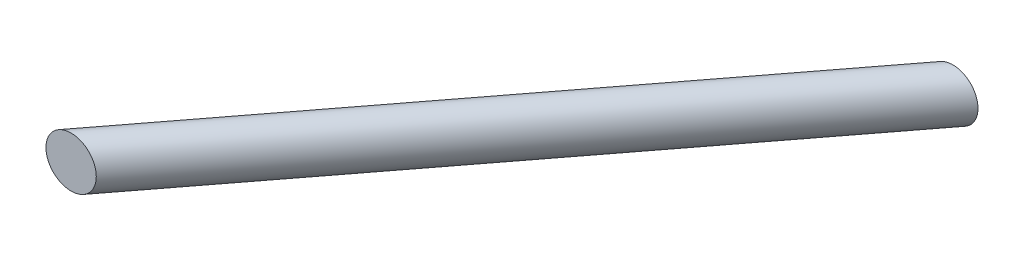
ISO-10303-21;
HEADER;
FILE_DESCRIPTION(('STEP AP214'),'2;1');
FILE_NAME('part.step','',(''),(''),'','','');
FILE_SCHEMA(('AUTOMOTIVE_DESIGN { 1 0 10303 214 1 1 1 1 }'));
ENDSEC;
DATA;
#1=APPLICATION_CONTEXT('core data for automotive mechanical design processes');
#2=APPLICATION_PROTOCOL_DEFINITION('international standard','automotive_design',2000,#1);
#3=PRODUCT_CONTEXT('',#1,'mechanical');
#4=PRODUCT('Part','Part','',(#3));
#5=PRODUCT_RELATED_PRODUCT_CATEGORY('part','',(#4));
#6=PRODUCT_DEFINITION_FORMATION('','',#4);
#7=PRODUCT_DEFINITION_CONTEXT('part definition',#1,'design');
#8=PRODUCT_DEFINITION('design','',#6,#7);
#9=PRODUCT_DEFINITION_SHAPE('','',#8);
#10=(LENGTH_UNIT() NAMED_UNIT(*) SI_UNIT(.MILLI.,.METRE.));
#11=(NAMED_UNIT(*) PLANE_ANGLE_UNIT() SI_UNIT($,.RADIAN.));
#12=(NAMED_UNIT(*) SI_UNIT($,.STERADIAN.) SOLID_ANGLE_UNIT());
#13=UNCERTAINTY_MEASURE_WITH_UNIT(LENGTH_MEASURE(1.E-05),#10,'distance_accuracy_value','');
#14=(GEOMETRIC_REPRESENTATION_CONTEXT(3) GLOBAL_UNCERTAINTY_ASSIGNED_CONTEXT((#13)) GLOBAL_UNIT_ASSIGNED_CONTEXT((#10,
#11,#12)) REPRESENTATION_CONTEXT('',''));
#15=CARTESIAN_POINT('',(0.,0.,0.));
#16=DIRECTION('',(0.,0.,1.));
#17=DIRECTION('',(1.,0.,0.));
#18=AXIS2_PLACEMENT_3D('',#15,#16,#17);
#19=CARTESIAN_POINT('',(-30.3479900980948,0.,39.7366266435129));
#20=DIRECTION('',(0.,0.,1.));
#21=DIRECTION('',(1.,0.,0.));
#22=AXIS2_PLACEMENT_3D('',#19,#20,#21);
#23=CIRCLE('',#22,2.);
#24=DIRECTION('',(0.606959801961895,0.,-0.794732532870259));
#25=VECTOR('',#24,1.);
#26=SURFACE_OF_LINEAR_EXTRUSION('',#23,#25);
#27=CARTESIAN_POINT('',(-28.3479900980948,0.,39.7366266435129));
#28=VERTEX_POINT('',#27);
#29=EDGE_CURVE('E10',#28,#28,#23,.T.);
#30=ORIENTED_EDGE('',*,*,#29,.F.);
#31=EDGE_LOOP('',(#30));
#32=FACE_BOUND('',#31,.T.);
#33=CARTESIAN_POINT('',(0.,0.,0.));
#34=DIRECTION('',(0.,0.,1.));
#35=DIRECTION('',(1.,0.,0.));
#36=AXIS2_PLACEMENT_3D('',#33,#34,#35);
#37=CIRCLE('',#36,2.);
#38=CARTESIAN_POINT('',(2.,0.,0.));
#39=VERTEX_POINT('',#38);
#40=EDGE_CURVE('E35',#39,#39,#37,.T.);
#41=ORIENTED_EDGE('',*,*,#40,.T.);
#42=EDGE_LOOP('',(#41));
#43=FACE_BOUND('',#42,.T.);
#44=ADVANCED_FACE('F31',(#32,#43),#26,.F.);
#45=CARTESIAN_POINT('',(-30.3479900980948,0.,39.7366266435129));
#46=DIRECTION('',(0.,0.,1.));
#47=DIRECTION('',(1.,0.,0.));
#48=AXIS2_PLACEMENT_3D('',#45,#46,#47);
#49=PLANE('',#48);
#50=ORIENTED_EDGE('',*,*,#29,.T.);
#51=EDGE_LOOP('',(#50));
#52=FACE_BOUND('',#51,.T.);
#53=ADVANCED_FACE('F47',(#52),#49,.T.);
#54=CARTESIAN_POINT('',(0.,0.,0.));
#55=DIRECTION('',(0.,0.,1.));
#56=DIRECTION('',(1.,0.,0.));
#57=AXIS2_PLACEMENT_3D('',#54,#55,#56);
#58=PLANE('',#57);
#59=ORIENTED_EDGE('',*,*,#40,.F.);
#60=EDGE_LOOP('',(#59));
#61=FACE_BOUND('',#60,.T.);
#62=ADVANCED_FACE('F45',(#61),#58,.F.);
#63=CLOSED_SHELL('',(#44,#53,#62));
#64=MANIFOLD_SOLID_BREP('B2',#63);
#65=ADVANCED_BREP_SHAPE_REPRESENTATION('',(#18,#64),#14);
#66=SHAPE_DEFINITION_REPRESENTATION(#9,#65);
ENDSEC;
END-ISO-10303-21;
